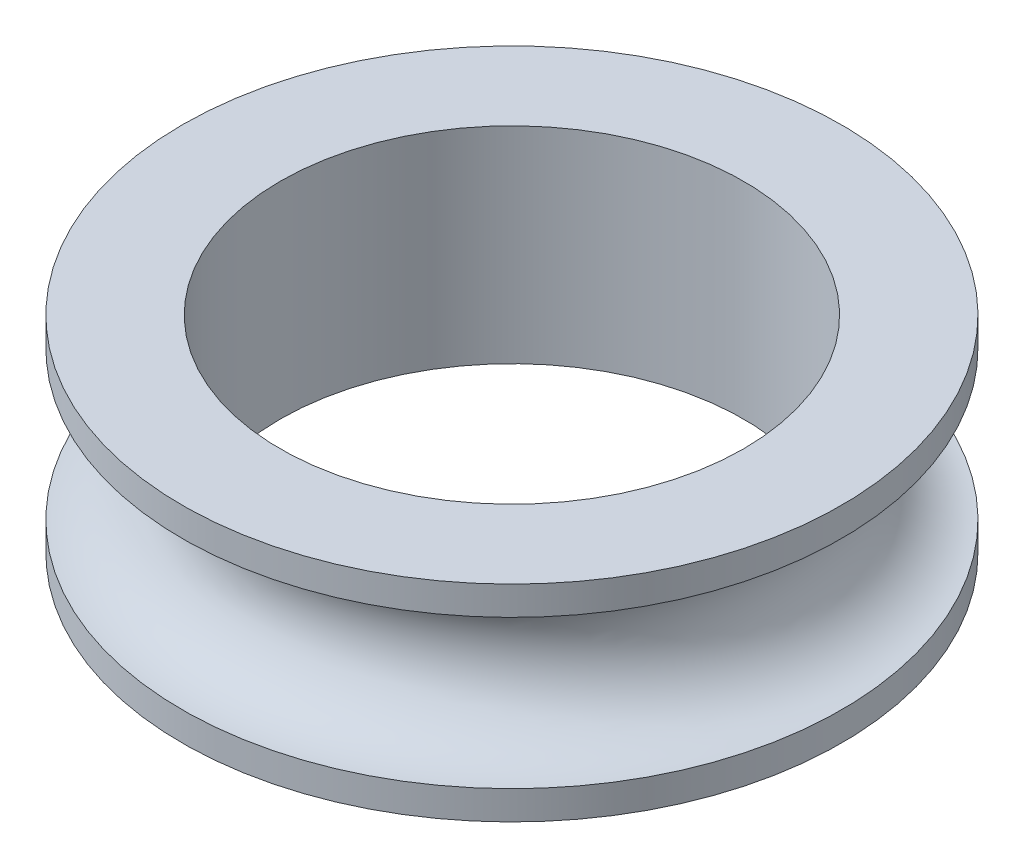
ISO-10303-21;
HEADER;
FILE_DESCRIPTION(('STEP AP214'),'2;1');
FILE_NAME('part.step','',(''),(''),'','','');
FILE_SCHEMA(('AUTOMOTIVE_DESIGN { 1 0 10303 214 1 1 1 1 }'));
ENDSEC;
DATA;
#1=APPLICATION_CONTEXT('core data for automotive mechanical design processes');
#2=APPLICATION_PROTOCOL_DEFINITION('international standard','automotive_design',2000,#1);
#3=PRODUCT_CONTEXT('',#1,'mechanical');
#4=PRODUCT('Part','Part','',(#3));
#5=PRODUCT_RELATED_PRODUCT_CATEGORY('part','',(#4));
#6=PRODUCT_DEFINITION_FORMATION('','',#4);
#7=PRODUCT_DEFINITION_CONTEXT('part definition',#1,'design');
#8=PRODUCT_DEFINITION('design','',#6,#7);
#9=PRODUCT_DEFINITION_SHAPE('','',#8);
#10=(LENGTH_UNIT() NAMED_UNIT(*) SI_UNIT(.MILLI.,.METRE.));
#11=(NAMED_UNIT(*) PLANE_ANGLE_UNIT() SI_UNIT($,.RADIAN.));
#12=(NAMED_UNIT(*) SI_UNIT($,.STERADIAN.) SOLID_ANGLE_UNIT());
#13=UNCERTAINTY_MEASURE_WITH_UNIT(LENGTH_MEASURE(1.E-05),#10,'distance_accuracy_value','');
#14=(GEOMETRIC_REPRESENTATION_CONTEXT(3) GLOBAL_UNCERTAINTY_ASSIGNED_CONTEXT((#13)) GLOBAL_UNIT_ASSIGNED_CONTEXT((#10,
#11,#12)) REPRESENTATION_CONTEXT('',''));
#15=CARTESIAN_POINT('',(0.,0.,0.));
#16=DIRECTION('',(0.,0.,1.));
#17=DIRECTION('',(1.,0.,0.));
#18=AXIS2_PLACEMENT_3D('',#15,#16,#17);
#19=CARTESIAN_POINT('',(0.,2.5,0.));
#20=DIRECTION('',(0.,1.,0.));
#21=DIRECTION('',(-1.,0.,0.));
#22=AXIS2_PLACEMENT_3D('',#19,#20,#21);
#23=PLANE('',#22);
#24=CARTESIAN_POINT('',(0.,2.5,0.));
#25=DIRECTION('',(0.,1.,0.));
#26=DIRECTION('',(-1.,0.,0.));
#27=AXIS2_PLACEMENT_3D('',#24,#25,#26);
#28=CIRCLE('',#27,5.625);
#29=CARTESIAN_POINT('',(-5.625,2.5,0.));
#30=VERTEX_POINT('',#29);
#31=EDGE_CURVE('E67',#30,#30,#28,.T.);
#32=ORIENTED_EDGE('',*,*,#31,.F.);
#33=EDGE_LOOP('',(#32));
#34=FACE_BOUND('',#33,.T.);
#35=CARTESIAN_POINT('',(0.,2.5,0.));
#36=DIRECTION('',(0.,1.,0.));
#37=DIRECTION('',(-1.,0.,0.));
#38=AXIS2_PLACEMENT_3D('',#35,#36,#37);
#39=CIRCLE('',#38,8.);
#40=CARTESIAN_POINT('',(-8.,2.5,0.));
#41=VERTEX_POINT('',#40);
#42=EDGE_CURVE('E10',#41,#41,#39,.T.);
#43=ORIENTED_EDGE('',*,*,#42,.T.);
#44=EDGE_LOOP('',(#43));
#45=FACE_BOUND('',#44,.T.);
#46=ADVANCED_FACE('F43',(#34,#45),#23,.T.);
#47=CARTESIAN_POINT('',(0.,2.5,0.));
#48=DIRECTION('',(0.,1.,0.));
#49=DIRECTION('',(-1.,0.,0.));
#50=AXIS2_PLACEMENT_3D('',#47,#48,#49);
#51=CYLINDRICAL_SURFACE('',#50,8.);
#52=CARTESIAN_POINT('',(0.,1.80000000000001,0.));
#53=DIRECTION('',(0.,1.,0.));
#54=DIRECTION('',(-1.,0.,0.));
#55=AXIS2_PLACEMENT_3D('',#52,#53,#54);
#56=CIRCLE('',#55,8.);
#57=CARTESIAN_POINT('',(-8.,1.8,0.));
#58=VERTEX_POINT('',#57);
#59=EDGE_CURVE('E50',#58,#58,#56,.T.);
#60=ORIENTED_EDGE('',*,*,#59,.T.);
#61=EDGE_LOOP('',(#60));
#62=FACE_BOUND('',#61,.T.);
#63=ORIENTED_EDGE('',*,*,#42,.F.);
#64=EDGE_LOOP('',(#63));
#65=FACE_BOUND('',#64,.T.);
#66=ADVANCED_FACE('F85',(#62,#65),#51,.T.);
#67=CARTESIAN_POINT('',(0.,0.,0.));
#68=DIRECTION('',(0.,1.,0.));
#69=DIRECTION('',(-1.,0.,0.));
#70=AXIS2_PLACEMENT_3D('',#67,#68,#69);
#71=TOROIDAL_SURFACE('',#70,8.,1.8);
#72=CARTESIAN_POINT('',(0.,-1.8,0.));
#73=DIRECTION('',(0.,1.,0.));
#74=DIRECTION('',(-1.,0.,0.));
#75=AXIS2_PLACEMENT_3D('',#72,#73,#74);
#76=CIRCLE('',#75,8.00000000000001);
#77=CARTESIAN_POINT('',(-8.00000000000001,-1.8,0.));
#78=VERTEX_POINT('',#77);
#79=EDGE_CURVE('E55',#78,#78,#76,.T.);
#80=ORIENTED_EDGE('',*,*,#79,.T.);
#81=EDGE_LOOP('',(#80));
#82=FACE_BOUND('',#81,.T.);
#83=ORIENTED_EDGE('',*,*,#59,.F.);
#84=EDGE_LOOP('',(#83));
#85=FACE_BOUND('',#84,.T.);
#86=ADVANCED_FACE('F91',(#82,#85),#71,.F.);
#87=CARTESIAN_POINT('',(0.,2.5,0.));
#88=DIRECTION('',(0.,1.,0.));
#89=DIRECTION('',(-1.,0.,0.));
#90=AXIS2_PLACEMENT_3D('',#87,#88,#89);
#91=CYLINDRICAL_SURFACE('',#90,8.);
#92=CARTESIAN_POINT('',(0.,-2.5,0.));
#93=DIRECTION('',(0.,1.,0.));
#94=DIRECTION('',(-1.,0.,0.));
#95=AXIS2_PLACEMENT_3D('',#92,#93,#94);
#96=CIRCLE('',#95,8.);
#97=CARTESIAN_POINT('',(-8.,-2.5,0.));
#98=VERTEX_POINT('',#97);
#99=EDGE_CURVE('E60',#98,#98,#96,.T.);
#100=ORIENTED_EDGE('',*,*,#99,.T.);
#101=EDGE_LOOP('',(#100));
#102=FACE_BOUND('',#101,.T.);
#103=ORIENTED_EDGE('',*,*,#79,.F.);
#104=EDGE_LOOP('',(#103));
#105=FACE_BOUND('',#104,.T.);
#106=ADVANCED_FACE('F95',(#102,#105),#91,.T.);
#107=CARTESIAN_POINT('',(0.,-2.5,0.));
#108=DIRECTION('',(0.,-1.,0.));
#109=DIRECTION('',(1.,0.,0.));
#110=AXIS2_PLACEMENT_3D('',#107,#108,#109);
#111=PLANE('',#110);
#112=CARTESIAN_POINT('',(0.,-2.50000000000001,0.));
#113=DIRECTION('',(0.,1.,0.));
#114=DIRECTION('',(-1.,0.,0.));
#115=AXIS2_PLACEMENT_3D('',#112,#113,#114);
#116=CIRCLE('',#115,5.625);
#117=CARTESIAN_POINT('',(-5.625,-2.50000000000001,0.));
#118=VERTEX_POINT('',#117);
#119=EDGE_CURVE('E66',#118,#118,#116,.T.);
#120=ORIENTED_EDGE('',*,*,#119,.T.);
#121=EDGE_LOOP('',(#120));
#122=FACE_BOUND('',#121,.T.);
#123=ORIENTED_EDGE('',*,*,#99,.F.);
#124=EDGE_LOOP('',(#123));
#125=FACE_BOUND('',#124,.T.);
#126=ADVANCED_FACE('F75',(#122,#125),#111,.T.);
#127=CARTESIAN_POINT('',(0.,-2.50000000000001,0.));
#128=DIRECTION('',(0.,1.,0.));
#129=DIRECTION('',(-1.,0.,0.));
#130=AXIS2_PLACEMENT_3D('',#127,#128,#129);
#131=CYLINDRICAL_SURFACE('',#130,5.625);
#132=ORIENTED_EDGE('',*,*,#119,.F.);
#133=EDGE_LOOP('',(#132));
#134=FACE_BOUND('',#133,.T.);
#135=ORIENTED_EDGE('',*,*,#31,.T.);
#136=EDGE_LOOP('',(#135));
#137=FACE_BOUND('',#136,.T.);
#138=ADVANCED_FACE('F78',(#134,#137),#131,.F.);
#139=CLOSED_SHELL('',(#46,#66,#86,#106,#126,#138));
#140=MANIFOLD_SOLID_BREP('B2',#139);
#141=ADVANCED_BREP_SHAPE_REPRESENTATION('',(#18,#140),#14);
#142=SHAPE_DEFINITION_REPRESENTATION(#9,#141);
ENDSEC;
END-ISO-10303-21;
